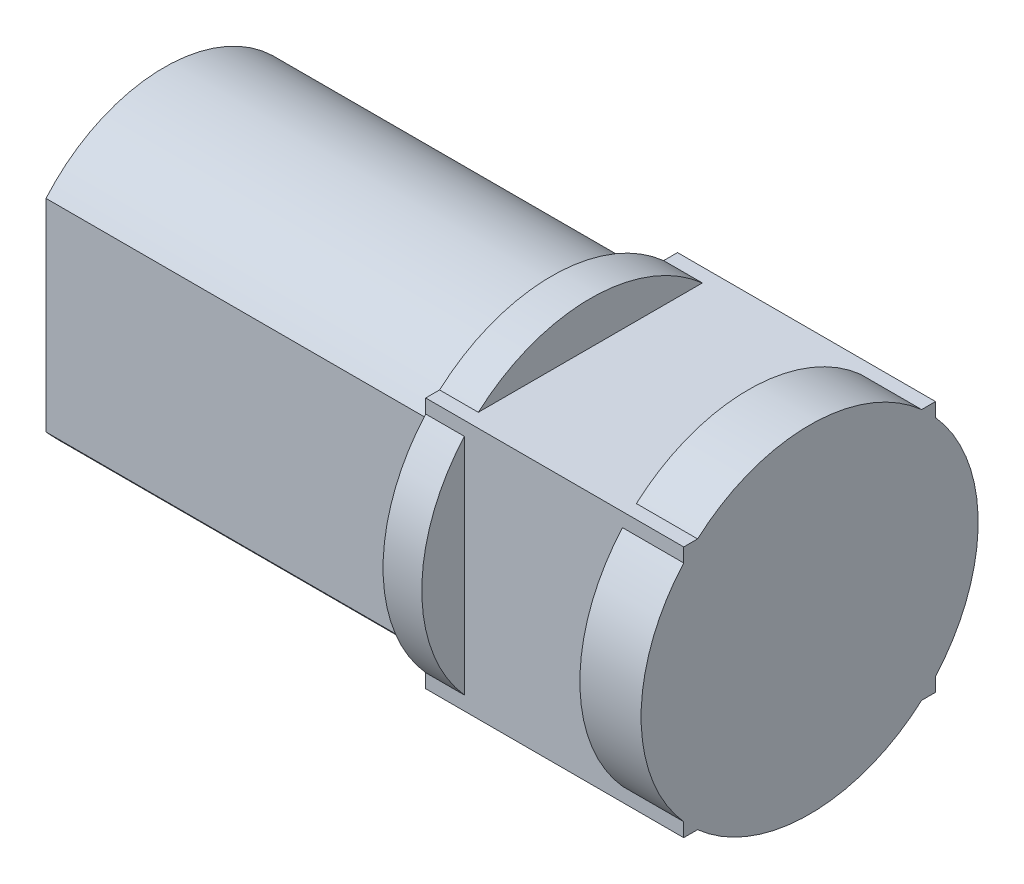
ISO-10303-21;
HEADER;
FILE_DESCRIPTION(('STEP AP214'),'2;1');
FILE_NAME('part.step','',(''),(''),'','','');
FILE_SCHEMA(('AUTOMOTIVE_DESIGN { 1 0 10303 214 1 1 1 1 }'));
ENDSEC;
DATA;
#1=APPLICATION_CONTEXT('core data for automotive mechanical design processes');
#2=APPLICATION_PROTOCOL_DEFINITION('international standard','automotive_design',2000,#1);
#3=PRODUCT_CONTEXT('',#1,'mechanical');
#4=PRODUCT('Part','Part','',(#3));
#5=PRODUCT_RELATED_PRODUCT_CATEGORY('part','',(#4));
#6=PRODUCT_DEFINITION_FORMATION('','',#4);
#7=PRODUCT_DEFINITION_CONTEXT('part definition',#1,'design');
#8=PRODUCT_DEFINITION('design','',#6,#7);
#9=PRODUCT_DEFINITION_SHAPE('','',#8);
#10=(LENGTH_UNIT() NAMED_UNIT(*) SI_UNIT(.MILLI.,.METRE.));
#11=(NAMED_UNIT(*) PLANE_ANGLE_UNIT() SI_UNIT($,.RADIAN.));
#12=(NAMED_UNIT(*) SI_UNIT($,.STERADIAN.) SOLID_ANGLE_UNIT());
#13=UNCERTAINTY_MEASURE_WITH_UNIT(LENGTH_MEASURE(1.E-05),#10,'distance_accuracy_value','');
#14=(GEOMETRIC_REPRESENTATION_CONTEXT(3) GLOBAL_UNCERTAINTY_ASSIGNED_CONTEXT((#13)) GLOBAL_UNIT_ASSIGNED_CONTEXT((#10,
#11,#12)) REPRESENTATION_CONTEXT('',''));
#15=CARTESIAN_POINT('',(0.,0.,0.));
#16=DIRECTION('',(0.,0.,1.));
#17=DIRECTION('',(1.,0.,0.));
#18=AXIS2_PLACEMENT_3D('',#15,#16,#17);
#19=CARTESIAN_POINT('',(-8.4582,0.,0.));
#20=DIRECTION('',(1.,0.,0.));
#21=DIRECTION('',(0.,0.,-1.));
#22=AXIS2_PLACEMENT_3D('',#19,#20,#21);
#23=PLANE('',#22);
#24=DIRECTION('',(0.,0.,-1.));
#25=VECTOR('',#24,1.);
#26=CARTESIAN_POINT('',(-8.4582,-8.255,8.255));
#27=LINE('',#26,#25);
#28=CARTESIAN_POINT('',(-8.4582,-8.255,-7.34407080575889));
#29=VERTEX_POINT('',#28);
#30=CARTESIAN_POINT('',(-8.4582,-8.255,-8.255));
#31=VERTEX_POINT('',#30);
#32=EDGE_CURVE('E330',#29,#31,#27,.T.);
#33=ORIENTED_EDGE('',*,*,#32,.F.);
#34=CARTESIAN_POINT('',(-8.4582,0.,0.));
#35=DIRECTION('',(-1.,0.,0.));
#36=DIRECTION('',(0.,0.,1.));
#37=AXIS2_PLACEMENT_3D('',#34,#35,#36);
#38=CIRCLE('',#37,11.049);
#39=CARTESIAN_POINT('',(-8.4582,-8.255,7.34407080575889));
#40=VERTEX_POINT('',#39);
#41=EDGE_CURVE('E224',#29,#40,#38,.T.);
#42=ORIENTED_EDGE('',*,*,#41,.T.);
#43=CARTESIAN_POINT('',(-8.4582,-8.255,8.255));
#44=VERTEX_POINT('',#43);
#45=EDGE_CURVE('E331',#44,#40,#27,.T.);
#46=ORIENTED_EDGE('',*,*,#45,.F.);
#47=DIRECTION('',(0.,-1.,0.));
#48=VECTOR('',#47,1.);
#49=CARTESIAN_POINT('',(-8.4582,8.255,8.255));
#50=LINE('',#49,#48);
#51=CARTESIAN_POINT('',(-8.4582,-7.34407080575889,8.255));
#52=VERTEX_POINT('',#51);
#53=EDGE_CURVE('E327',#52,#44,#50,.T.);
#54=ORIENTED_EDGE('',*,*,#53,.F.);
#55=CARTESIAN_POINT('',(-8.4582,7.34407080575889,8.255));
#56=VERTEX_POINT('',#55);
#57=EDGE_CURVE('E221',#52,#56,#38,.T.);
#58=ORIENTED_EDGE('',*,*,#57,.T.);
#59=CARTESIAN_POINT('',(-8.4582,8.255,8.255));
#60=VERTEX_POINT('',#59);
#61=EDGE_CURVE('E328',#60,#56,#50,.T.);
#62=ORIENTED_EDGE('',*,*,#61,.F.);
#63=DIRECTION('',(0.,0.,1.));
#64=VECTOR('',#63,1.);
#65=CARTESIAN_POINT('',(-8.4582,8.255,8.255));
#66=LINE('',#65,#64);
#67=CARTESIAN_POINT('',(-8.4582,8.255,7.34407080575889));
#68=VERTEX_POINT('',#67);
#69=EDGE_CURVE('E324',#68,#60,#66,.T.);
#70=ORIENTED_EDGE('',*,*,#69,.F.);
#71=CARTESIAN_POINT('',(-8.4582,8.255,-7.34407080575889));
#72=VERTEX_POINT('',#71);
#73=EDGE_CURVE('E226',#68,#72,#38,.T.);
#74=ORIENTED_EDGE('',*,*,#73,.T.);
#75=CARTESIAN_POINT('',(-8.4582,8.255,-8.255));
#76=VERTEX_POINT('',#75);
#77=EDGE_CURVE('E325',#76,#72,#66,.T.);
#78=ORIENTED_EDGE('',*,*,#77,.F.);
#79=DIRECTION('',(0.,1.,0.));
#80=VECTOR('',#79,1.);
#81=CARTESIAN_POINT('',(-8.4582,8.255,-8.255));
#82=LINE('',#81,#80);
#83=CARTESIAN_POINT('',(-8.4582,7.34407080575889,-8.255));
#84=VERTEX_POINT('',#83);
#85=EDGE_CURVE('E304',#84,#76,#82,.T.);
#86=ORIENTED_EDGE('',*,*,#85,.F.);
#87=CARTESIAN_POINT('',(-8.4582,-7.34407080575889,-8.255));
#88=VERTEX_POINT('',#87);
#89=EDGE_CURVE('E692',#84,#88,#38,.T.);
#90=ORIENTED_EDGE('',*,*,#89,.T.);
#91=EDGE_CURVE('E322',#31,#88,#82,.T.);
#92=ORIENTED_EDGE('',*,*,#91,.F.);
#93=EDGE_LOOP('',(#33,#42,#46,#54,#58,#62,#70,#74,#78,#86,#90,#92));
#94=FACE_BOUND('',#93,.T.);
#95=CARTESIAN_POINT('',(-8.4582,0.,0.));
#96=DIRECTION('',(-1.,0.,0.));
#97=DIRECTION('',(0.,0.,1.));
#98=AXIS2_PLACEMENT_3D('',#95,#96,#97);
#99=CIRCLE('',#98,10.1981);
#100=CARTESIAN_POINT('',(-8.4582,-6.63213650417424,-7.747));
#101=VERTEX_POINT('',#100);
#102=CARTESIAN_POINT('',(-8.4582,-6.63213650417424,7.747));
#103=VERTEX_POINT('',#102);
#104=EDGE_CURVE('E220',#101,#103,#99,.T.);
#105=ORIENTED_EDGE('',*,*,#104,.F.);
#106=DIRECTION('',(0.,-1.,0.));
#107=VECTOR('',#106,1.);
#108=CARTESIAN_POINT('',(-8.4582,-6.63213650417424,-7.747));
#109=LINE('',#108,#107);
#110=CARTESIAN_POINT('',(-8.4582,6.63213650417424,-7.747));
#111=VERTEX_POINT('',#110);
#112=EDGE_CURVE('E217',#111,#101,#109,.T.);
#113=ORIENTED_EDGE('',*,*,#112,.F.);
#114=CARTESIAN_POINT('',(-8.4582,0.,0.));
#115=DIRECTION('',(-1.,0.,0.));
#116=DIRECTION('',(0.,0.,1.));
#117=AXIS2_PLACEMENT_3D('',#114,#115,#116);
#118=CIRCLE('',#117,10.1981);
#119=CARTESIAN_POINT('',(-8.4582,6.63213650417424,7.747));
#120=VERTEX_POINT('',#119);
#121=EDGE_CURVE('E59',#120,#111,#118,.T.);
#122=ORIENTED_EDGE('',*,*,#121,.F.);
#123=DIRECTION('',(0.,1.,0.));
#124=VECTOR('',#123,1.);
#125=CARTESIAN_POINT('',(-8.4582,-6.63213650417424,7.747));
#126=LINE('',#125,#124);
#127=EDGE_CURVE('E54',#103,#120,#126,.T.);
#128=ORIENTED_EDGE('',*,*,#127,.F.);
#129=EDGE_LOOP('',(#105,#113,#122,#128));
#130=FACE_BOUND('',#129,.T.);
#131=ADVANCED_FACE('F39',(#94,#130),#23,.F.);
#132=CARTESIAN_POINT('',(8.4582,8.255,-8.255));
#133=DIRECTION('',(0.,0.,1.));
#134=DIRECTION('',(0.,-1.,0.));
#135=AXIS2_PLACEMENT_3D('',#132,#133,#134);
#136=PLANE('',#135);
#137=DIRECTION('',(0.,-1.,0.));
#138=VECTOR('',#137,1.);
#139=CARTESIAN_POINT('',(-5.9182,8.255,-8.255));
#140=LINE('',#139,#138);
#141=CARTESIAN_POINT('',(-5.9182,7.34407080575889,-8.255));
#142=VERTEX_POINT('',#141);
#143=CARTESIAN_POINT('',(-5.9182,-7.34407080575889,-8.255));
#144=VERTEX_POINT('',#143);
#145=EDGE_CURVE('E262',#142,#144,#140,.T.);
#146=ORIENTED_EDGE('',*,*,#145,.F.);
#147=DIRECTION('',(-1.,0.,0.));
#148=VECTOR('',#147,1.);
#149=CARTESIAN_POINT('',(-5.9182,7.34407080575889,-8.255));
#150=LINE('',#149,#148);
#151=EDGE_CURVE('E253',#142,#84,#150,.T.);
#152=ORIENTED_EDGE('',*,*,#151,.T.);
#153=ORIENTED_EDGE('',*,*,#85,.T.);
#154=DIRECTION('',(-1.,0.,0.));
#155=VECTOR('',#154,1.);
#156=CARTESIAN_POINT('',(8.4582,8.255,-8.255));
#157=LINE('',#156,#155);
#158=CARTESIAN_POINT('',(8.4582,8.255,-8.255));
#159=VERTEX_POINT('',#158);
#160=EDGE_CURVE('E341',#159,#76,#157,.T.);
#161=ORIENTED_EDGE('',*,*,#160,.F.);
#162=DIRECTION('',(0.,1.,0.));
#163=VECTOR('',#162,1.);
#164=CARTESIAN_POINT('',(8.4582,8.255,-8.255));
#165=LINE('',#164,#163);
#166=CARTESIAN_POINT('',(8.4582,7.34407080575889,-8.255));
#167=VERTEX_POINT('',#166);
#168=EDGE_CURVE('E309',#167,#159,#165,.T.);
#169=ORIENTED_EDGE('',*,*,#168,.F.);
#170=DIRECTION('',(1.,0.,0.));
#171=VECTOR('',#170,1.);
#172=CARTESIAN_POINT('',(4.445,7.34407080575889,-8.255));
#173=LINE('',#172,#171);
#174=CARTESIAN_POINT('',(4.445,7.34407080575889,-8.255));
#175=VERTEX_POINT('',#174);
#176=EDGE_CURVE('E292',#167,#175,#173,.F.);
#177=ORIENTED_EDGE('',*,*,#176,.T.);
#178=DIRECTION('',(0.,1.,0.));
#179=VECTOR('',#178,1.);
#180=CARTESIAN_POINT('',(4.445,8.255,-8.255));
#181=LINE('',#180,#179);
#182=CARTESIAN_POINT('',(4.445,-7.34407080575889,-8.255));
#183=VERTEX_POINT('',#182);
#184=EDGE_CURVE('E302',#183,#175,#181,.T.);
#185=ORIENTED_EDGE('',*,*,#184,.F.);
#186=DIRECTION('',(1.,0.,0.));
#187=VECTOR('',#186,1.);
#188=CARTESIAN_POINT('',(4.445,-7.34407080575889,-8.255));
#189=LINE('',#188,#187);
#190=CARTESIAN_POINT('',(8.4582,-7.34407080575889,-8.255));
#191=VERTEX_POINT('',#190);
#192=EDGE_CURVE('E295',#183,#191,#189,.T.);
#193=ORIENTED_EDGE('',*,*,#192,.T.);
#194=CARTESIAN_POINT('',(8.4582,-8.255,-8.255));
#195=VERTEX_POINT('',#194);
#196=EDGE_CURVE('E305',#195,#191,#165,.T.);
#197=ORIENTED_EDGE('',*,*,#196,.F.);
#198=DIRECTION('',(-1.,0.,0.));
#199=VECTOR('',#198,1.);
#200=CARTESIAN_POINT('',(8.4582,-8.255,-8.255));
#201=LINE('',#200,#199);
#202=EDGE_CURVE('E321',#195,#31,#201,.T.);
#203=ORIENTED_EDGE('',*,*,#202,.T.);
#204=ORIENTED_EDGE('',*,*,#91,.T.);
#205=DIRECTION('',(-1.,0.,0.));
#206=VECTOR('',#205,1.);
#207=CARTESIAN_POINT('',(-5.9182,-7.34407080575889,-8.255));
#208=LINE('',#207,#206);
#209=EDGE_CURVE('E251',#88,#144,#208,.F.);
#210=ORIENTED_EDGE('',*,*,#209,.T.);
#211=EDGE_LOOP('',(#146,#152,#153,#161,#169,#177,#185,#193,#197,#203,#204,#210));
#212=FACE_BOUND('',#211,.T.);
#213=ADVANCED_FACE('F41',(#212),#136,.F.);
#214=CARTESIAN_POINT('',(8.4582,8.255,8.255));
#215=DIRECTION('',(0.,-1.,0.));
#216=DIRECTION('',(0.,0.,-1.));
#217=AXIS2_PLACEMENT_3D('',#214,#215,#216);
#218=PLANE('',#217);
#219=DIRECTION('',(0.,0.,-1.));
#220=VECTOR('',#219,1.);
#221=CARTESIAN_POINT('',(-5.9182,8.255,8.255));
#222=LINE('',#221,#220);
#223=CARTESIAN_POINT('',(-5.9182,8.255,7.34407080575889));
#224=VERTEX_POINT('',#223);
#225=CARTESIAN_POINT('',(-5.9182,8.255,-7.34407080575889));
#226=VERTEX_POINT('',#225);
#227=EDGE_CURVE('E259',#224,#226,#222,.T.);
#228=ORIENTED_EDGE('',*,*,#227,.F.);
#229=DIRECTION('',(-1.,0.,0.));
#230=VECTOR('',#229,1.);
#231=CARTESIAN_POINT('',(-5.9182,8.255,7.34407080575889));
#232=LINE('',#231,#230);
#233=EDGE_CURVE('E248',#224,#68,#232,.T.);
#234=ORIENTED_EDGE('',*,*,#233,.T.);
#235=ORIENTED_EDGE('',*,*,#69,.T.);
#236=DIRECTION('',(-1.,0.,0.));
#237=VECTOR('',#236,1.);
#238=CARTESIAN_POINT('',(8.4582,8.255,8.255));
#239=LINE('',#238,#237);
#240=CARTESIAN_POINT('',(8.4582,8.255,8.255));
#241=VERTEX_POINT('',#240);
#242=EDGE_CURVE('E338',#241,#60,#239,.T.);
#243=ORIENTED_EDGE('',*,*,#242,.F.);
#244=DIRECTION('',(0.,0.,1.));
#245=VECTOR('',#244,1.);
#246=CARTESIAN_POINT('',(8.4582,8.255,8.255));
#247=LINE('',#246,#245);
#248=CARTESIAN_POINT('',(8.4582,8.255,7.34407080575889));
#249=VERTEX_POINT('',#248);
#250=EDGE_CURVE('E308',#249,#241,#247,.T.);
#251=ORIENTED_EDGE('',*,*,#250,.F.);
#252=DIRECTION('',(1.,0.,0.));
#253=VECTOR('',#252,1.);
#254=CARTESIAN_POINT('',(4.445,8.255,7.34407080575889));
#255=LINE('',#254,#253);
#256=CARTESIAN_POINT('',(4.445,8.255,7.34407080575889));
#257=VERTEX_POINT('',#256);
#258=EDGE_CURVE('E286',#249,#257,#255,.F.);
#259=ORIENTED_EDGE('',*,*,#258,.T.);
#260=DIRECTION('',(0.,0.,1.));
#261=VECTOR('',#260,1.);
#262=CARTESIAN_POINT('',(4.445,8.255,8.255));
#263=LINE('',#262,#261);
#264=CARTESIAN_POINT('',(4.445,8.255,-7.34407080575889));
#265=VERTEX_POINT('',#264);
#266=EDGE_CURVE('E300',#265,#257,#263,.T.);
#267=ORIENTED_EDGE('',*,*,#266,.F.);
#268=DIRECTION('',(1.,0.,0.));
#269=VECTOR('',#268,1.);
#270=CARTESIAN_POINT('',(4.445,8.255,-7.34407080575889));
#271=LINE('',#270,#269);
#272=CARTESIAN_POINT('',(8.4582,8.255,-7.34407080575889));
#273=VERTEX_POINT('',#272);
#274=EDGE_CURVE('E289',#265,#273,#271,.T.);
#275=ORIENTED_EDGE('',*,*,#274,.T.);
#276=EDGE_CURVE('E310',#159,#273,#247,.T.);
#277=ORIENTED_EDGE('',*,*,#276,.F.);
#278=ORIENTED_EDGE('',*,*,#160,.T.);
#279=ORIENTED_EDGE('',*,*,#77,.T.);
#280=DIRECTION('',(-1.,0.,0.));
#281=VECTOR('',#280,1.);
#282=CARTESIAN_POINT('',(-5.9182,8.255,-7.34407080575889));
#283=LINE('',#282,#281);
#284=EDGE_CURVE('E246',#72,#226,#283,.F.);
#285=ORIENTED_EDGE('',*,*,#284,.T.);
#286=EDGE_LOOP('',(#228,#234,#235,#243,#251,#259,#267,#275,#277,#278,#279,#285));
#287=FACE_BOUND('',#286,.T.);
#288=ADVANCED_FACE('F372',(#287),#218,.F.);
#289=CARTESIAN_POINT('',(8.4582,8.255,8.255));
#290=DIRECTION('',(0.,0.,-1.));
#291=DIRECTION('',(0.,1.,0.));
#292=AXIS2_PLACEMENT_3D('',#289,#290,#291);
#293=PLANE('',#292);
#294=DIRECTION('',(0.,1.,0.));
#295=VECTOR('',#294,1.);
#296=CARTESIAN_POINT('',(-5.9182,8.255,8.255));
#297=LINE('',#296,#295);
#298=CARTESIAN_POINT('',(-5.9182,-7.34407080575889,8.255));
#299=VERTEX_POINT('',#298);
#300=CARTESIAN_POINT('',(-5.9182,7.34407080575889,8.255));
#301=VERTEX_POINT('',#300);
#302=EDGE_CURVE('E256',#299,#301,#297,.T.);
#303=ORIENTED_EDGE('',*,*,#302,.F.);
#304=DIRECTION('',(-1.,0.,0.));
#305=VECTOR('',#304,1.);
#306=CARTESIAN_POINT('',(-5.9182,-7.34407080575889,8.255));
#307=LINE('',#306,#305);
#308=EDGE_CURVE('E243',#299,#52,#307,.T.);
#309=ORIENTED_EDGE('',*,*,#308,.T.);
#310=ORIENTED_EDGE('',*,*,#53,.T.);
#311=DIRECTION('',(-1.,0.,0.));
#312=VECTOR('',#311,1.);
#313=CARTESIAN_POINT('',(8.4582,-8.255,8.255));
#314=LINE('',#313,#312);
#315=CARTESIAN_POINT('',(8.4582,-8.255,8.255));
#316=VERTEX_POINT('',#315);
#317=EDGE_CURVE('E335',#316,#44,#314,.T.);
#318=ORIENTED_EDGE('',*,*,#317,.F.);
#319=DIRECTION('',(0.,-1.,0.));
#320=VECTOR('',#319,1.);
#321=CARTESIAN_POINT('',(8.4582,8.255,8.255));
#322=LINE('',#321,#320);
#323=CARTESIAN_POINT('',(8.4582,-7.34407080575889,8.255));
#324=VERTEX_POINT('',#323);
#325=EDGE_CURVE('E313',#324,#316,#322,.T.);
#326=ORIENTED_EDGE('',*,*,#325,.F.);
#327=DIRECTION('',(1.,0.,0.));
#328=VECTOR('',#327,1.);
#329=CARTESIAN_POINT('',(4.445,-7.34407080575889,8.255));
#330=LINE('',#329,#328);
#331=CARTESIAN_POINT('',(4.445,-7.34407080575889,8.255));
#332=VERTEX_POINT('',#331);
#333=EDGE_CURVE('E280',#324,#332,#330,.F.);
#334=ORIENTED_EDGE('',*,*,#333,.T.);
#335=DIRECTION('',(0.,-1.,0.));
#336=VECTOR('',#335,1.);
#337=CARTESIAN_POINT('',(4.445,8.255,8.255));
#338=LINE('',#337,#336);
#339=CARTESIAN_POINT('',(4.445,7.34407080575889,8.255));
#340=VERTEX_POINT('',#339);
#341=EDGE_CURVE('E298',#340,#332,#338,.T.);
#342=ORIENTED_EDGE('',*,*,#341,.F.);
#343=DIRECTION('',(1.,0.,0.));
#344=VECTOR('',#343,1.);
#345=CARTESIAN_POINT('',(4.445,7.34407080575889,8.255));
#346=LINE('',#345,#344);
#347=CARTESIAN_POINT('',(8.4582,7.34407080575889,8.255));
#348=VERTEX_POINT('',#347);
#349=EDGE_CURVE('E283',#340,#348,#346,.T.);
#350=ORIENTED_EDGE('',*,*,#349,.T.);
#351=EDGE_CURVE('E314',#241,#348,#322,.T.);
#352=ORIENTED_EDGE('',*,*,#351,.F.);
#353=ORIENTED_EDGE('',*,*,#242,.T.);
#354=ORIENTED_EDGE('',*,*,#61,.T.);
#355=DIRECTION('',(-1.,0.,0.));
#356=VECTOR('',#355,1.);
#357=CARTESIAN_POINT('',(-5.9182,7.34407080575889,8.255));
#358=LINE('',#357,#356);
#359=EDGE_CURVE('E241',#56,#301,#358,.F.);
#360=ORIENTED_EDGE('',*,*,#359,.T.);
#361=EDGE_LOOP('',(#303,#309,#310,#318,#326,#334,#342,#350,#352,#353,#354,#360));
#362=FACE_BOUND('',#361,.T.);
#363=ADVANCED_FACE('F376',(#362),#293,.F.);
#364=CARTESIAN_POINT('',(8.4582,-8.255,8.255));
#365=DIRECTION('',(0.,1.,0.));
#366=DIRECTION('',(0.,0.,1.));
#367=AXIS2_PLACEMENT_3D('',#364,#365,#366);
#368=PLANE('',#367);
#369=DIRECTION('',(0.,0.,1.));
#370=VECTOR('',#369,1.);
#371=CARTESIAN_POINT('',(-5.9182,-8.255,8.255));
#372=LINE('',#371,#370);
#373=CARTESIAN_POINT('',(-5.9182,-8.255,-7.34407080575889));
#374=VERTEX_POINT('',#373);
#375=CARTESIAN_POINT('',(-5.9182,-8.255,7.34407080575889));
#376=VERTEX_POINT('',#375);
#377=EDGE_CURVE('E11',#374,#376,#372,.T.);
#378=ORIENTED_EDGE('',*,*,#377,.F.);
#379=DIRECTION('',(-1.,0.,0.));
#380=VECTOR('',#379,1.);
#381=CARTESIAN_POINT('',(-5.9182,-8.255,-7.34407080575889));
#382=LINE('',#381,#380);
#383=EDGE_CURVE('E238',#374,#29,#382,.T.);
#384=ORIENTED_EDGE('',*,*,#383,.T.);
#385=ORIENTED_EDGE('',*,*,#32,.T.);
#386=ORIENTED_EDGE('',*,*,#202,.F.);
#387=DIRECTION('',(0.,0.,-1.));
#388=VECTOR('',#387,1.);
#389=CARTESIAN_POINT('',(8.4582,-8.255,8.255));
#390=LINE('',#389,#388);
#391=CARTESIAN_POINT('',(8.4582,-8.255,-7.34407080575889));
#392=VERTEX_POINT('',#391);
#393=EDGE_CURVE('E317',#392,#195,#390,.T.);
#394=ORIENTED_EDGE('',*,*,#393,.F.);
#395=DIRECTION('',(1.,0.,0.));
#396=VECTOR('',#395,1.);
#397=CARTESIAN_POINT('',(4.445,-8.255,-7.34407080575889));
#398=LINE('',#397,#396);
#399=CARTESIAN_POINT('',(4.445,-8.255,-7.34407080575889));
#400=VERTEX_POINT('',#399);
#401=EDGE_CURVE('E274',#392,#400,#398,.F.);
#402=ORIENTED_EDGE('',*,*,#401,.T.);
#403=DIRECTION('',(0.,0.,-1.));
#404=VECTOR('',#403,1.);
#405=CARTESIAN_POINT('',(4.445,-8.255,8.255));
#406=LINE('',#405,#404);
#407=CARTESIAN_POINT('',(4.445,-8.255,7.34407080575889));
#408=VERTEX_POINT('',#407);
#409=EDGE_CURVE('E47',#408,#400,#406,.T.);
#410=ORIENTED_EDGE('',*,*,#409,.F.);
#411=DIRECTION('',(1.,0.,0.));
#412=VECTOR('',#411,1.);
#413=CARTESIAN_POINT('',(4.445,-8.255,7.34407080575889));
#414=LINE('',#413,#412);
#415=CARTESIAN_POINT('',(8.4582,-8.255,7.34407080575889));
#416=VERTEX_POINT('',#415);
#417=EDGE_CURVE('E277',#408,#416,#414,.T.);
#418=ORIENTED_EDGE('',*,*,#417,.T.);
#419=EDGE_CURVE('E318',#316,#416,#390,.T.);
#420=ORIENTED_EDGE('',*,*,#419,.F.);
#421=ORIENTED_EDGE('',*,*,#317,.T.);
#422=ORIENTED_EDGE('',*,*,#45,.T.);
#423=DIRECTION('',(-1.,0.,0.));
#424=VECTOR('',#423,1.);
#425=CARTESIAN_POINT('',(-5.9182,-8.255,7.34407080575889));
#426=LINE('',#425,#424);
#427=EDGE_CURVE('E236',#40,#376,#426,.F.);
#428=ORIENTED_EDGE('',*,*,#427,.T.);
#429=EDGE_LOOP('',(#378,#384,#385,#386,#394,#402,#410,#418,#420,#421,#422,#428));
#430=FACE_BOUND('',#429,.T.);
#431=ADVANCED_FACE('F354',(#430),#368,.F.);
#432=CARTESIAN_POINT('',(8.4582,0.,0.));
#433=DIRECTION('',(1.,0.,0.));
#434=DIRECTION('',(0.,0.,-1.));
#435=AXIS2_PLACEMENT_3D('',#432,#433,#434);
#436=PLANE('',#435);
#437=ORIENTED_EDGE('',*,*,#196,.T.);
#438=CARTESIAN_POINT('',(8.4582,0.,0.));
#439=DIRECTION('',(1.,0.,0.));
#440=DIRECTION('',(0.,0.,-1.));
#441=AXIS2_PLACEMENT_3D('',#438,#439,#440);
#442=CIRCLE('',#441,11.049);
#443=EDGE_CURVE('E265',#191,#167,#442,.T.);
#444=ORIENTED_EDGE('',*,*,#443,.T.);
#445=ORIENTED_EDGE('',*,*,#168,.T.);
#446=ORIENTED_EDGE('',*,*,#276,.T.);
#447=EDGE_CURVE('E270',#273,#249,#442,.T.);
#448=ORIENTED_EDGE('',*,*,#447,.T.);
#449=ORIENTED_EDGE('',*,*,#250,.T.);
#450=ORIENTED_EDGE('',*,*,#351,.T.);
#451=EDGE_CURVE('E360',#348,#324,#442,.T.);
#452=ORIENTED_EDGE('',*,*,#451,.T.);
#453=ORIENTED_EDGE('',*,*,#325,.T.);
#454=ORIENTED_EDGE('',*,*,#419,.T.);
#455=EDGE_CURVE('E273',#416,#392,#442,.T.);
#456=ORIENTED_EDGE('',*,*,#455,.T.);
#457=ORIENTED_EDGE('',*,*,#393,.T.);
#458=EDGE_LOOP('',(#437,#444,#445,#446,#448,#449,#450,#452,#453,#454,#456,#457));
#459=FACE_BOUND('',#458,.T.);
#460=ADVANCED_FACE('F358',(#459),#436,.T.);
#461=CARTESIAN_POINT('',(4.445,0.,0.));
#462=DIRECTION('',(1.,0.,0.));
#463=DIRECTION('',(0.,0.,-1.));
#464=AXIS2_PLACEMENT_3D('',#461,#462,#463);
#465=PLANE('',#464);
#466=CARTESIAN_POINT('',(4.445,0.,0.));
#467=DIRECTION('',(1.,0.,0.));
#468=DIRECTION('',(0.,0.,-1.));
#469=AXIS2_PLACEMENT_3D('',#466,#467,#468);
#470=CIRCLE('',#469,11.049);
#471=EDGE_CURVE('E269',#408,#400,#470,.T.);
#472=ORIENTED_EDGE('',*,*,#471,.F.);
#473=ORIENTED_EDGE('',*,*,#409,.T.);
#474=EDGE_LOOP('',(#472,#473));
#475=FACE_BOUND('',#474,.T.);
#476=ADVANCED_FACE('F347',(#475),#465,.F.);
#477=CARTESIAN_POINT('',(4.445,0.,0.));
#478=DIRECTION('',(1.,0.,0.));
#479=DIRECTION('',(0.,0.,-1.));
#480=AXIS2_PLACEMENT_3D('',#477,#478,#479);
#481=CYLINDRICAL_SURFACE('',#480,11.049);
#482=ORIENTED_EDGE('',*,*,#417,.F.);
#483=ORIENTED_EDGE('',*,*,#471,.T.);
#484=ORIENTED_EDGE('',*,*,#401,.F.);
#485=ORIENTED_EDGE('',*,*,#455,.F.);
#486=EDGE_LOOP('',(#482,#483,#484,#485));
#487=FACE_BOUND('',#486,.T.);
#488=ADVANCED_FACE('F351',(#487),#481,.T.);
#489=EDGE_CURVE('E353',#340,#332,#470,.T.);
#490=ORIENTED_EDGE('',*,*,#489,.F.);
#491=ORIENTED_EDGE('',*,*,#341,.T.);
#492=EDGE_LOOP('',(#490,#491));
#493=FACE_BOUND('',#492,.T.);
#494=ADVANCED_FACE('F383',(#493),#465,.F.);
#495=ORIENTED_EDGE('',*,*,#349,.F.);
#496=ORIENTED_EDGE('',*,*,#489,.T.);
#497=ORIENTED_EDGE('',*,*,#333,.F.);
#498=ORIENTED_EDGE('',*,*,#451,.F.);
#499=EDGE_LOOP('',(#495,#496,#497,#498));
#500=FACE_BOUND('',#499,.T.);
#501=ADVANCED_FACE('F381',(#500),#481,.T.);
#502=EDGE_CURVE('E271',#265,#257,#470,.T.);
#503=ORIENTED_EDGE('',*,*,#502,.F.);
#504=ORIENTED_EDGE('',*,*,#266,.T.);
#505=EDGE_LOOP('',(#503,#504));
#506=FACE_BOUND('',#505,.T.);
#507=ADVANCED_FACE('F386',(#506),#465,.F.);
#508=ORIENTED_EDGE('',*,*,#274,.F.);
#509=ORIENTED_EDGE('',*,*,#502,.T.);
#510=ORIENTED_EDGE('',*,*,#258,.F.);
#511=ORIENTED_EDGE('',*,*,#447,.F.);
#512=EDGE_LOOP('',(#508,#509,#510,#511));
#513=FACE_BOUND('',#512,.T.);
#514=ADVANCED_FACE('F368',(#513),#481,.T.);
#515=EDGE_CURVE('E266',#183,#175,#470,.T.);
#516=ORIENTED_EDGE('',*,*,#515,.F.);
#517=ORIENTED_EDGE('',*,*,#184,.T.);
#518=EDGE_LOOP('',(#516,#517));
#519=FACE_BOUND('',#518,.T.);
#520=ADVANCED_FACE('F393',(#519),#465,.F.);
#521=ORIENTED_EDGE('',*,*,#192,.F.);
#522=ORIENTED_EDGE('',*,*,#515,.T.);
#523=ORIENTED_EDGE('',*,*,#176,.F.);
#524=ORIENTED_EDGE('',*,*,#443,.F.);
#525=EDGE_LOOP('',(#521,#522,#523,#524));
#526=FACE_BOUND('',#525,.T.);
#527=ADVANCED_FACE('F392',(#526),#481,.T.);
#528=CARTESIAN_POINT('',(-5.9182,0.,0.));
#529=DIRECTION('',(-1.,0.,0.));
#530=DIRECTION('',(0.,0.,1.));
#531=AXIS2_PLACEMENT_3D('',#528,#529,#530);
#532=PLANE('',#531);
#533=CARTESIAN_POINT('',(-5.9182,0.,0.));
#534=DIRECTION('',(-1.,0.,0.));
#535=DIRECTION('',(0.,0.,1.));
#536=AXIS2_PLACEMENT_3D('',#533,#534,#535);
#537=CIRCLE('',#536,11.049);
#538=EDGE_CURVE('E233',#374,#376,#537,.T.);
#539=ORIENTED_EDGE('',*,*,#538,.F.);
#540=ORIENTED_EDGE('',*,*,#377,.T.);
#541=EDGE_LOOP('',(#539,#540));
#542=FACE_BOUND('',#541,.T.);
#543=ADVANCED_FACE('F482',(#542),#532,.F.);
#544=CARTESIAN_POINT('',(-5.9182,0.,0.));
#545=DIRECTION('',(-1.,0.,0.));
#546=DIRECTION('',(0.,0.,1.));
#547=AXIS2_PLACEMENT_3D('',#544,#545,#546);
#548=CYLINDRICAL_SURFACE('',#547,11.049);
#549=ORIENTED_EDGE('',*,*,#383,.F.);
#550=ORIENTED_EDGE('',*,*,#538,.T.);
#551=ORIENTED_EDGE('',*,*,#427,.F.);
#552=ORIENTED_EDGE('',*,*,#41,.F.);
#553=EDGE_LOOP('',(#549,#550,#551,#552));
#554=FACE_BOUND('',#553,.T.);
#555=ADVANCED_FACE('F529',(#554),#548,.T.);
#556=EDGE_CURVE('E231',#299,#301,#537,.T.);
#557=ORIENTED_EDGE('',*,*,#556,.F.);
#558=ORIENTED_EDGE('',*,*,#302,.T.);
#559=EDGE_LOOP('',(#557,#558));
#560=FACE_BOUND('',#559,.T.);
#561=ADVANCED_FACE('F533',(#560),#532,.F.);
#562=ORIENTED_EDGE('',*,*,#308,.F.);
#563=ORIENTED_EDGE('',*,*,#556,.T.);
#564=ORIENTED_EDGE('',*,*,#359,.F.);
#565=ORIENTED_EDGE('',*,*,#57,.F.);
#566=EDGE_LOOP('',(#562,#563,#564,#565));
#567=FACE_BOUND('',#566,.T.);
#568=ADVANCED_FACE('F542',(#567),#548,.T.);
#569=EDGE_CURVE('E234',#224,#226,#537,.T.);
#570=ORIENTED_EDGE('',*,*,#569,.F.);
#571=ORIENTED_EDGE('',*,*,#227,.T.);
#572=EDGE_LOOP('',(#570,#571));
#573=FACE_BOUND('',#572,.T.);
#574=ADVANCED_FACE('F551',(#573),#532,.F.);
#575=ORIENTED_EDGE('',*,*,#233,.F.);
#576=ORIENTED_EDGE('',*,*,#569,.T.);
#577=ORIENTED_EDGE('',*,*,#284,.F.);
#578=ORIENTED_EDGE('',*,*,#73,.F.);
#579=EDGE_LOOP('',(#575,#576,#577,#578));
#580=FACE_BOUND('',#579,.T.);
#581=ADVANCED_FACE('F560',(#580),#548,.T.);
#582=EDGE_CURVE('E690',#142,#144,#537,.T.);
#583=ORIENTED_EDGE('',*,*,#582,.F.);
#584=ORIENTED_EDGE('',*,*,#145,.T.);
#585=EDGE_LOOP('',(#583,#584));
#586=FACE_BOUND('',#585,.T.);
#587=ADVANCED_FACE('F532',(#586),#532,.F.);
#588=ORIENTED_EDGE('',*,*,#151,.F.);
#589=ORIENTED_EDGE('',*,*,#582,.T.);
#590=ORIENTED_EDGE('',*,*,#209,.F.);
#591=ORIENTED_EDGE('',*,*,#89,.F.);
#592=EDGE_LOOP('',(#588,#589,#590,#591));
#593=FACE_BOUND('',#592,.T.);
#594=ADVANCED_FACE('F541',(#593),#548,.T.);
#595=CARTESIAN_POINT('',(-33.8582,0.,0.));
#596=DIRECTION('',(1.,0.,0.));
#597=DIRECTION('',(0.,0.,-1.));
#598=AXIS2_PLACEMENT_3D('',#595,#596,#597);
#599=CYLINDRICAL_SURFACE('',#598,10.1981);
#600=ORIENTED_EDGE('',*,*,#104,.T.);
#601=DIRECTION('',(1.,0.,0.));
#602=VECTOR('',#601,1.);
#603=CARTESIAN_POINT('',(-33.8582,-6.63213650417424,7.747));
#604=LINE('',#603,#602);
#605=CARTESIAN_POINT('',(-33.8582,-6.63213650417424,7.747));
#606=VERTEX_POINT('',#605);
#607=EDGE_CURVE('E201',#606,#103,#604,.T.);
#608=ORIENTED_EDGE('',*,*,#607,.F.);
#609=CARTESIAN_POINT('',(-33.8582,0.,0.));
#610=DIRECTION('',(-1.,0.,0.));
#611=DIRECTION('',(0.,0.,1.));
#612=AXIS2_PLACEMENT_3D('',#609,#610,#611);
#613=CIRCLE('',#612,10.1981);
#614=CARTESIAN_POINT('',(-33.8582,-6.63213650417424,-7.747));
#615=VERTEX_POINT('',#614);
#616=EDGE_CURVE('E208',#615,#606,#613,.T.);
#617=ORIENTED_EDGE('',*,*,#616,.F.);
#618=DIRECTION('',(1.,0.,0.));
#619=VECTOR('',#618,1.);
#620=CARTESIAN_POINT('',(-33.8582,-6.63213650417424,-7.747));
#621=LINE('',#620,#619);
#622=EDGE_CURVE('E674',#615,#101,#621,.T.);
#623=ORIENTED_EDGE('',*,*,#622,.T.);
#624=EDGE_LOOP('',(#600,#608,#617,#623));
#625=FACE_BOUND('',#624,.T.);
#626=ADVANCED_FACE('F219',(#625),#599,.T.);
#627=CARTESIAN_POINT('',(-33.8582,-6.63213650417424,7.747));
#628=DIRECTION('',(0.,0.,-1.));
#629=DIRECTION('',(-1.,0.,0.));
#630=AXIS2_PLACEMENT_3D('',#627,#628,#629);
#631=PLANE('',#630);
#632=ORIENTED_EDGE('',*,*,#127,.T.);
#633=DIRECTION('',(1.,0.,0.));
#634=VECTOR('',#633,1.);
#635=CARTESIAN_POINT('',(-33.8582,6.63213650417424,7.747));
#636=LINE('',#635,#634);
#637=CARTESIAN_POINT('',(-33.8582,6.63213650417424,7.747));
#638=VERTEX_POINT('',#637);
#639=EDGE_CURVE('E204',#638,#120,#636,.T.);
#640=ORIENTED_EDGE('',*,*,#639,.F.);
#641=DIRECTION('',(0.,1.,0.));
#642=VECTOR('',#641,1.);
#643=CARTESIAN_POINT('',(-33.8582,-6.63213650417424,7.747));
#644=LINE('',#643,#642);
#645=EDGE_CURVE('E197',#606,#638,#644,.T.);
#646=ORIENTED_EDGE('',*,*,#645,.F.);
#647=ORIENTED_EDGE('',*,*,#607,.T.);
#648=EDGE_LOOP('',(#632,#640,#646,#647));
#649=FACE_BOUND('',#648,.T.);
#650=ADVANCED_FACE('F199',(#649),#631,.F.);
#651=CARTESIAN_POINT('',(-33.8582,0.,0.));
#652=DIRECTION('',(1.,0.,0.));
#653=DIRECTION('',(0.,0.,-1.));
#654=AXIS2_PLACEMENT_3D('',#651,#652,#653);
#655=CYLINDRICAL_SURFACE('',#654,10.1981);
#656=ORIENTED_EDGE('',*,*,#121,.T.);
#657=DIRECTION('',(1.,0.,0.));
#658=VECTOR('',#657,1.);
#659=CARTESIAN_POINT('',(-33.8582,6.63213650417424,-7.747));
#660=LINE('',#659,#658);
#661=CARTESIAN_POINT('',(-33.8582,6.63213650417424,-7.747));
#662=VERTEX_POINT('',#661);
#663=EDGE_CURVE('E227',#662,#111,#660,.T.);
#664=ORIENTED_EDGE('',*,*,#663,.F.);
#665=CARTESIAN_POINT('',(-33.8582,0.,0.));
#666=DIRECTION('',(-1.,0.,0.));
#667=DIRECTION('',(0.,0.,1.));
#668=AXIS2_PLACEMENT_3D('',#665,#666,#667);
#669=CIRCLE('',#668,10.1981);
#670=EDGE_CURVE('E207',#638,#662,#669,.T.);
#671=ORIENTED_EDGE('',*,*,#670,.F.);
#672=ORIENTED_EDGE('',*,*,#639,.T.);
#673=EDGE_LOOP('',(#656,#664,#671,#672));
#674=FACE_BOUND('',#673,.T.);
#675=ADVANCED_FACE('F615',(#674),#655,.T.);
#676=CARTESIAN_POINT('',(-33.8582,-6.63213650417424,-7.747));
#677=DIRECTION('',(0.,0.,1.));
#678=DIRECTION('',(1.,0.,0.));
#679=AXIS2_PLACEMENT_3D('',#676,#677,#678);
#680=PLANE('',#679);
#681=ORIENTED_EDGE('',*,*,#112,.T.);
#682=ORIENTED_EDGE('',*,*,#622,.F.);
#683=DIRECTION('',(0.,-1.,0.));
#684=VECTOR('',#683,1.);
#685=CARTESIAN_POINT('',(-33.8582,-6.63213650417424,-7.747));
#686=LINE('',#685,#684);
#687=EDGE_CURVE('E213',#662,#615,#686,.T.);
#688=ORIENTED_EDGE('',*,*,#687,.F.);
#689=ORIENTED_EDGE('',*,*,#663,.T.);
#690=EDGE_LOOP('',(#681,#682,#688,#689));
#691=FACE_BOUND('',#690,.T.);
#692=ADVANCED_FACE('F624',(#691),#680,.F.);
#693=CARTESIAN_POINT('',(-33.8582,0.,0.));
#694=DIRECTION('',(-1.,0.,0.));
#695=DIRECTION('',(0.,0.,1.));
#696=AXIS2_PLACEMENT_3D('',#693,#694,#695);
#697=PLANE('',#696);
#698=ORIENTED_EDGE('',*,*,#616,.T.);
#699=ORIENTED_EDGE('',*,*,#645,.T.);
#700=ORIENTED_EDGE('',*,*,#670,.T.);
#701=ORIENTED_EDGE('',*,*,#687,.T.);
#702=EDGE_LOOP('',(#698,#699,#700,#701));
#703=FACE_BOUND('',#702,.T.);
#704=ADVANCED_FACE('F211',(#703),#697,.T.);
#705=CLOSED_SHELL('',(#131,#213,#288,#363,#431,#460,#476,#488,#494,#501,#507,#514,#520,#527,
#543,#555,#561,#568,#574,#581,#587,#594,#626,#650,#675,#692,#704));
#706=MANIFOLD_SOLID_BREP('B2',#705);
#707=ADVANCED_BREP_SHAPE_REPRESENTATION('',(#18,#706),#14);
#708=SHAPE_DEFINITION_REPRESENTATION(#9,#707);
ENDSEC;
END-ISO-10303-21;
